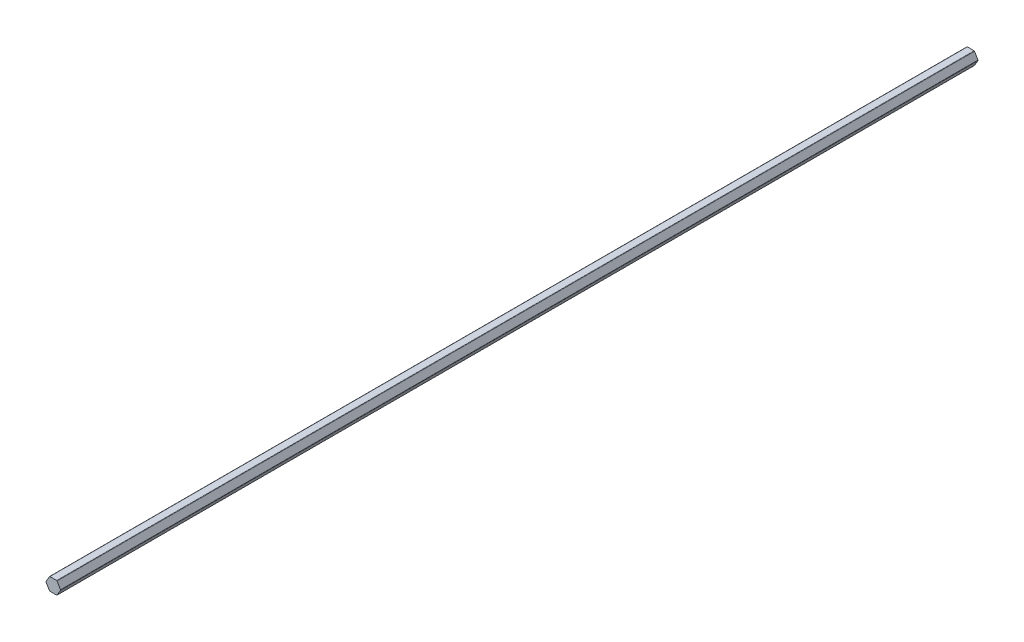
ISO-10303-21;
HEADER;
FILE_DESCRIPTION(('STEP AP214'),'2;1');
FILE_NAME('part.step','',(''),(''),'','','');
FILE_SCHEMA(('AUTOMOTIVE_DESIGN { 1 0 10303 214 1 1 1 1 }'));
ENDSEC;
DATA;
#1=APPLICATION_CONTEXT('core data for automotive mechanical design processes');
#2=APPLICATION_PROTOCOL_DEFINITION('international standard','automotive_design',2000,#1);
#3=PRODUCT_CONTEXT('',#1,'mechanical');
#4=PRODUCT('Part','Part','',(#3));
#5=PRODUCT_RELATED_PRODUCT_CATEGORY('part','',(#4));
#6=PRODUCT_DEFINITION_FORMATION('','',#4);
#7=PRODUCT_DEFINITION_CONTEXT('part definition',#1,'design');
#8=PRODUCT_DEFINITION('design','',#6,#7);
#9=PRODUCT_DEFINITION_SHAPE('','',#8);
#10=(LENGTH_UNIT() NAMED_UNIT(*) SI_UNIT(.MILLI.,.METRE.));
#11=(NAMED_UNIT(*) PLANE_ANGLE_UNIT() SI_UNIT($,.RADIAN.));
#12=(NAMED_UNIT(*) SI_UNIT($,.STERADIAN.) SOLID_ANGLE_UNIT());
#13=UNCERTAINTY_MEASURE_WITH_UNIT(LENGTH_MEASURE(1.E-05),#10,'distance_accuracy_value','');
#14=(GEOMETRIC_REPRESENTATION_CONTEXT(3) GLOBAL_UNCERTAINTY_ASSIGNED_CONTEXT((#13)) GLOBAL_UNIT_ASSIGNED_CONTEXT((#10,
#11,#12)) REPRESENTATION_CONTEXT('',''));
#15=CARTESIAN_POINT('',(0.,0.,0.));
#16=DIRECTION('',(0.,0.,1.));
#17=DIRECTION('',(1.,0.,0.));
#18=AXIS2_PLACEMENT_3D('',#15,#16,#17);
#19=CARTESIAN_POINT('',(-3.36554792418708,-5.8293,457.2));
#20=DIRECTION('',(0.,0.,-1.));
#21=DIRECTION('',(-1.,0.,0.));
#22=AXIS2_PLACEMENT_3D('',#19,#20,#21);
#23=CYLINDRICAL_SURFACE('',#22,0.508);
#24=CARTESIAN_POINT('',(-3.36554792418708,-5.8293,-457.2));
#25=DIRECTION('',(0.,0.,-1.));
#26=DIRECTION('',(-1.,0.,0.));
#27=AXIS2_PLACEMENT_3D('',#24,#25,#26);
#28=CIRCLE('',#27,0.508);
#29=CARTESIAN_POINT('',(-3.80548882930957,-6.0833,-457.2));
#30=VERTEX_POINT('',#29);
#31=CARTESIAN_POINT('',(-3.36554792418708,-6.3373,-457.2));
#32=VERTEX_POINT('',#31);
#33=EDGE_CURVE('E123',#30,#32,#28,.F.);
#34=ORIENTED_EDGE('',*,*,#33,.T.);
#35=DIRECTION('',(0.,0.,1.));
#36=VECTOR('',#35,1.);
#37=CARTESIAN_POINT('',(-3.36554792418708,-6.3373,457.2));
#38=LINE('',#37,#36);
#39=CARTESIAN_POINT('',(-3.36554792418708,-6.3373,457.2));
#40=VERTEX_POINT('',#39);
#41=EDGE_CURVE('E155',#32,#40,#38,.T.);
#42=ORIENTED_EDGE('',*,*,#41,.T.);
#43=CARTESIAN_POINT('',(-3.36554792418708,-5.8293,457.2));
#44=DIRECTION('',(0.,0.,-1.));
#45=DIRECTION('',(-1.,0.,0.));
#46=AXIS2_PLACEMENT_3D('',#43,#44,#45);
#47=CIRCLE('',#46,0.508);
#48=CARTESIAN_POINT('',(-3.80548882930957,-6.0833,457.2));
#49=VERTEX_POINT('',#48);
#50=EDGE_CURVE('E20',#40,#49,#47,.T.);
#51=ORIENTED_EDGE('',*,*,#50,.T.);
#52=DIRECTION('',(0.,0.,1.));
#53=VECTOR('',#52,1.);
#54=CARTESIAN_POINT('',(-3.80548882930957,-6.0833,457.2));
#55=LINE('',#54,#53);
#56=EDGE_CURVE('E119',#49,#30,#55,.F.);
#57=ORIENTED_EDGE('',*,*,#56,.T.);
#58=EDGE_LOOP('',(#34,#42,#51,#57));
#59=FACE_BOUND('',#58,.T.);
#60=ADVANCED_FACE('F17',(#59),#23,.T.);
#61=CARTESIAN_POINT('',(3.36554792418708,5.8293,457.2));
#62=DIRECTION('',(0.,0.,-1.));
#63=DIRECTION('',(-1.,0.,0.));
#64=AXIS2_PLACEMENT_3D('',#61,#62,#63);
#65=CYLINDRICAL_SURFACE('',#64,0.508);
#66=CARTESIAN_POINT('',(3.36554792418708,5.8293,-457.2));
#67=DIRECTION('',(0.,0.,-1.));
#68=DIRECTION('',(-1.,0.,0.));
#69=AXIS2_PLACEMENT_3D('',#66,#67,#68);
#70=CIRCLE('',#69,0.508);
#71=CARTESIAN_POINT('',(3.80548882930958,6.0833,-457.2));
#72=VERTEX_POINT('',#71);
#73=CARTESIAN_POINT('',(3.36554792418708,6.3373,-457.2));
#74=VERTEX_POINT('',#73);
#75=EDGE_CURVE('E177',#72,#74,#70,.F.);
#76=ORIENTED_EDGE('',*,*,#75,.T.);
#77=DIRECTION('',(0.,0.,1.));
#78=VECTOR('',#77,1.);
#79=CARTESIAN_POINT('',(3.36554792418708,6.3373,457.2));
#80=LINE('',#79,#78);
#81=CARTESIAN_POINT('',(3.36554792418708,6.3373,457.2));
#82=VERTEX_POINT('',#81);
#83=EDGE_CURVE('E147',#74,#82,#80,.T.);
#84=ORIENTED_EDGE('',*,*,#83,.T.);
#85=CARTESIAN_POINT('',(3.36554792418708,5.8293,457.2));
#86=DIRECTION('',(0.,0.,-1.));
#87=DIRECTION('',(-1.,0.,0.));
#88=AXIS2_PLACEMENT_3D('',#85,#86,#87);
#89=CIRCLE('',#88,0.508);
#90=CARTESIAN_POINT('',(3.80548882930958,6.0833,457.2));
#91=VERTEX_POINT('',#90);
#92=EDGE_CURVE('E179',#82,#91,#89,.T.);
#93=ORIENTED_EDGE('',*,*,#92,.T.);
#94=DIRECTION('',(0.,0.,1.));
#95=VECTOR('',#94,1.);
#96=CARTESIAN_POINT('',(3.80548882930958,6.0833,457.2));
#97=LINE('',#96,#95);
#98=EDGE_CURVE('E150',#91,#72,#97,.F.);
#99=ORIENTED_EDGE('',*,*,#98,.T.);
#100=EDGE_LOOP('',(#76,#84,#93,#99));
#101=FACE_BOUND('',#100,.T.);
#102=ADVANCED_FACE('F259',(#101),#65,.T.);
#103=CARTESIAN_POINT('',(-3.36554792418708,5.8293,457.2));
#104=DIRECTION('',(0.,0.,-1.));
#105=DIRECTION('',(-1.,0.,0.));
#106=AXIS2_PLACEMENT_3D('',#103,#104,#105);
#107=CYLINDRICAL_SURFACE('',#106,0.508);
#108=CARTESIAN_POINT('',(-3.36554792418708,5.8293,-457.2));
#109=DIRECTION('',(0.,0.,-1.));
#110=DIRECTION('',(-1.,0.,0.));
#111=AXIS2_PLACEMENT_3D('',#108,#109,#110);
#112=CIRCLE('',#111,0.508);
#113=CARTESIAN_POINT('',(-3.36554792418708,6.3373,-457.2));
#114=VERTEX_POINT('',#113);
#115=CARTESIAN_POINT('',(-3.80548882930958,6.0833,-457.2));
#116=VERTEX_POINT('',#115);
#117=EDGE_CURVE('E173',#114,#116,#112,.F.);
#118=ORIENTED_EDGE('',*,*,#117,.T.);
#119=DIRECTION('',(0.,0.,1.));
#120=VECTOR('',#119,1.);
#121=CARTESIAN_POINT('',(-3.80548882930958,6.0833,457.2));
#122=LINE('',#121,#120);
#123=CARTESIAN_POINT('',(-3.80548882930958,6.0833,457.2));
#124=VERTEX_POINT('',#123);
#125=EDGE_CURVE('E141',#116,#124,#122,.T.);
#126=ORIENTED_EDGE('',*,*,#125,.T.);
#127=CARTESIAN_POINT('',(-3.36554792418708,5.8293,457.2));
#128=DIRECTION('',(0.,0.,-1.));
#129=DIRECTION('',(-1.,0.,0.));
#130=AXIS2_PLACEMENT_3D('',#127,#128,#129);
#131=CIRCLE('',#130,0.508);
#132=CARTESIAN_POINT('',(-3.36554792418708,6.3373,457.2));
#133=VERTEX_POINT('',#132);
#134=EDGE_CURVE('E175',#124,#133,#131,.T.);
#135=ORIENTED_EDGE('',*,*,#134,.T.);
#136=DIRECTION('',(0.,0.,1.));
#137=VECTOR('',#136,1.);
#138=CARTESIAN_POINT('',(-3.36554792418708,6.3373,457.2));
#139=LINE('',#138,#137);
#140=EDGE_CURVE('E144',#133,#114,#139,.F.);
#141=ORIENTED_EDGE('',*,*,#140,.T.);
#142=EDGE_LOOP('',(#118,#126,#135,#141));
#143=FACE_BOUND('',#142,.T.);
#144=ADVANCED_FACE('F261',(#143),#107,.T.);
#145=CARTESIAN_POINT('',(-6.73109584837417,0.,457.2));
#146=DIRECTION('',(0.,0.,-1.));
#147=DIRECTION('',(-1.,0.,0.));
#148=AXIS2_PLACEMENT_3D('',#145,#146,#147);
#149=CYLINDRICAL_SURFACE('',#148,0.508);
#150=DIRECTION('',(0.,0.,1.));
#151=VECTOR('',#150,1.);
#152=CARTESIAN_POINT('',(-7.17103675349666,0.253999999999996,457.2));
#153=LINE('',#152,#151);
#154=CARTESIAN_POINT('',(-7.17103675349666,0.253999999999996,457.2));
#155=VERTEX_POINT('',#154);
#156=CARTESIAN_POINT('',(-7.17103675349666,0.253999999999996,-457.2));
#157=VERTEX_POINT('',#156);
#158=EDGE_CURVE('E105',#155,#157,#153,.F.);
#159=ORIENTED_EDGE('',*,*,#158,.T.);
#160=CARTESIAN_POINT('',(-6.73109584837417,0.,-457.2));
#161=DIRECTION('',(0.,0.,-1.));
#162=DIRECTION('',(-1.,0.,0.));
#163=AXIS2_PLACEMENT_3D('',#160,#161,#162);
#164=CIRCLE('',#163,0.508);
#165=CARTESIAN_POINT('',(-7.17103675349666,-0.254000000000004,-457.2));
#166=VERTEX_POINT('',#165);
#167=EDGE_CURVE('E99',#157,#166,#164,.F.);
#168=ORIENTED_EDGE('',*,*,#167,.T.);
#169=DIRECTION('',(0.,0.,1.));
#170=VECTOR('',#169,1.);
#171=CARTESIAN_POINT('',(-7.17103675349666,-0.254000000000004,457.2));
#172=LINE('',#171,#170);
#173=CARTESIAN_POINT('',(-7.17103675349666,-0.254000000000004,457.2));
#174=VERTEX_POINT('',#173);
#175=EDGE_CURVE('E102',#166,#174,#172,.T.);
#176=ORIENTED_EDGE('',*,*,#175,.T.);
#177=CARTESIAN_POINT('',(-6.73109584837417,0.,457.2));
#178=DIRECTION('',(0.,0.,-1.));
#179=DIRECTION('',(-1.,0.,0.));
#180=AXIS2_PLACEMENT_3D('',#177,#178,#179);
#181=CIRCLE('',#180,0.508);
#182=EDGE_CURVE('E110',#174,#155,#181,.T.);
#183=ORIENTED_EDGE('',*,*,#182,.T.);
#184=EDGE_LOOP('',(#159,#168,#176,#183));
#185=FACE_BOUND('',#184,.T.);
#186=ADVANCED_FACE('F101',(#185),#149,.T.);
#187=CARTESIAN_POINT('',(-7.31768372187083,0.,457.2));
#188=DIRECTION('',(0.866025403784438,0.5,0.));
#189=DIRECTION('',(-0.5,0.866025403784438,0.));
#190=AXIS2_PLACEMENT_3D('',#187,#188,#189);
#191=PLANE('',#190);
#192=ORIENTED_EDGE('',*,*,#56,.F.);
#193=DIRECTION('',(0.500000000000001,-0.866025403784438,0.));
#194=VECTOR('',#193,1.);
#195=CARTESIAN_POINT('',(-7.17103675349666,-0.254000000000004,457.2));
#196=LINE('',#195,#194);
#197=EDGE_CURVE('E118',#174,#49,#196,.T.);
#198=ORIENTED_EDGE('',*,*,#197,.F.);
#199=ORIENTED_EDGE('',*,*,#175,.F.);
#200=DIRECTION('',(0.500000000000001,-0.866025403784438,0.));
#201=VECTOR('',#200,1.);
#202=CARTESIAN_POINT('',(-7.17103675349666,-0.254000000000004,-457.2));
#203=LINE('',#202,#201);
#204=EDGE_CURVE('E116',#166,#30,#203,.T.);
#205=ORIENTED_EDGE('',*,*,#204,.T.);
#206=EDGE_LOOP('',(#192,#198,#199,#205));
#207=FACE_BOUND('',#206,.T.);
#208=ADVANCED_FACE('F115',(#207),#191,.F.);
#209=CARTESIAN_POINT('',(-3.65884186093541,-6.3373,457.2));
#210=DIRECTION('',(0.,1.,0.));
#211=DIRECTION('',(-1.,0.,0.));
#212=AXIS2_PLACEMENT_3D('',#209,#210,#211);
#213=PLANE('',#212);
#214=ORIENTED_EDGE('',*,*,#41,.F.);
#215=DIRECTION('',(1.,0.,0.));
#216=VECTOR('',#215,1.);
#217=CARTESIAN_POINT('',(7.31768372187083,-6.3373,-457.2));
#218=LINE('',#217,#216);
#219=CARTESIAN_POINT('',(3.36554792418708,-6.3373,-457.2));
#220=VERTEX_POINT('',#219);
#221=EDGE_CURVE('E125',#32,#220,#218,.T.);
#222=ORIENTED_EDGE('',*,*,#221,.T.);
#223=DIRECTION('',(0.,0.,-1.));
#224=VECTOR('',#223,1.);
#225=CARTESIAN_POINT('',(3.36554792418708,-6.3373,457.2));
#226=LINE('',#225,#224);
#227=CARTESIAN_POINT('',(3.36554792418708,-6.3373,457.2));
#228=VERTEX_POINT('',#227);
#229=EDGE_CURVE('E129',#228,#220,#226,.T.);
#230=ORIENTED_EDGE('',*,*,#229,.F.);
#231=DIRECTION('',(1.,0.,0.));
#232=VECTOR('',#231,1.);
#233=CARTESIAN_POINT('',(7.31768372187083,-6.3373,457.2));
#234=LINE('',#233,#232);
#235=EDGE_CURVE('E168',#40,#228,#234,.T.);
#236=ORIENTED_EDGE('',*,*,#235,.F.);
#237=EDGE_LOOP('',(#214,#222,#230,#236));
#238=FACE_BOUND('',#237,.T.);
#239=ADVANCED_FACE('F214',(#238),#213,.F.);
#240=CARTESIAN_POINT('',(7.31768372187083,0.,457.2));
#241=DIRECTION('',(-0.866025403784439,-0.5,0.));
#242=DIRECTION('',(0.5,-0.866025403784439,0.));
#243=AXIS2_PLACEMENT_3D('',#240,#241,#242);
#244=PLANE('',#243);
#245=DIRECTION('',(0.,0.,-1.));
#246=VECTOR('',#245,1.);
#247=CARTESIAN_POINT('',(7.17103675349666,0.254000000000004,457.2));
#248=LINE('',#247,#246);
#249=CARTESIAN_POINT('',(7.17103675349666,0.254000000000003,-457.2));
#250=VERTEX_POINT('',#249);
#251=CARTESIAN_POINT('',(7.17103675349666,0.254000000000003,457.2));
#252=VERTEX_POINT('',#251);
#253=EDGE_CURVE('E146',#250,#252,#248,.F.);
#254=ORIENTED_EDGE('',*,*,#253,.F.);
#255=DIRECTION('',(-0.5,0.866025403784438,0.));
#256=VECTOR('',#255,1.);
#257=CARTESIAN_POINT('',(7.17103675349666,0.254000000000003,-457.2));
#258=LINE('',#257,#256);
#259=EDGE_CURVE('E137',#250,#72,#258,.T.);
#260=ORIENTED_EDGE('',*,*,#259,.T.);
#261=ORIENTED_EDGE('',*,*,#98,.F.);
#262=DIRECTION('',(-0.5,0.866025403784438,0.));
#263=VECTOR('',#262,1.);
#264=CARTESIAN_POINT('',(7.17103675349666,0.254000000000003,457.2));
#265=LINE('',#264,#263);
#266=EDGE_CURVE('E166',#252,#91,#265,.T.);
#267=ORIENTED_EDGE('',*,*,#266,.F.);
#268=EDGE_LOOP('',(#254,#260,#261,#267));
#269=FACE_BOUND('',#268,.T.);
#270=ADVANCED_FACE('F216',(#269),#244,.F.);
#271=CARTESIAN_POINT('',(3.65884186093541,6.3373,457.2));
#272=DIRECTION('',(0.,-1.,0.));
#273=DIRECTION('',(1.,0.,0.));
#274=AXIS2_PLACEMENT_3D('',#271,#272,#273);
#275=PLANE('',#274);
#276=ORIENTED_EDGE('',*,*,#140,.F.);
#277=DIRECTION('',(1.,0.,0.));
#278=VECTOR('',#277,1.);
#279=CARTESIAN_POINT('',(7.31768372187083,6.3373,457.2));
#280=LINE('',#279,#278);
#281=EDGE_CURVE('E252',#82,#133,#280,.F.);
#282=ORIENTED_EDGE('',*,*,#281,.F.);
#283=ORIENTED_EDGE('',*,*,#83,.F.);
#284=DIRECTION('',(1.,0.,0.));
#285=VECTOR('',#284,1.);
#286=CARTESIAN_POINT('',(7.31768372187083,6.3373,-457.2));
#287=LINE('',#286,#285);
#288=EDGE_CURVE('E131',#74,#114,#287,.F.);
#289=ORIENTED_EDGE('',*,*,#288,.T.);
#290=EDGE_LOOP('',(#276,#282,#283,#289));
#291=FACE_BOUND('',#290,.T.);
#292=ADVANCED_FACE('F223',(#291),#275,.F.);
#293=CARTESIAN_POINT('',(-3.65884186093541,6.3373,457.2));
#294=DIRECTION('',(0.866025403784439,-0.5,0.));
#295=DIRECTION('',(0.5,0.866025403784439,0.));
#296=AXIS2_PLACEMENT_3D('',#293,#294,#295);
#297=PLANE('',#296);
#298=ORIENTED_EDGE('',*,*,#158,.F.);
#299=DIRECTION('',(-0.5,-0.866025403784439,0.));
#300=VECTOR('',#299,1.);
#301=CARTESIAN_POINT('',(-3.80548882930958,6.0833,457.2));
#302=LINE('',#301,#300);
#303=EDGE_CURVE('E195',#124,#155,#302,.T.);
#304=ORIENTED_EDGE('',*,*,#303,.F.);
#305=ORIENTED_EDGE('',*,*,#125,.F.);
#306=DIRECTION('',(-0.5,-0.866025403784439,0.));
#307=VECTOR('',#306,1.);
#308=CARTESIAN_POINT('',(-3.80548882930958,6.0833,-457.2));
#309=LINE('',#308,#307);
#310=EDGE_CURVE('E126',#116,#157,#309,.T.);
#311=ORIENTED_EDGE('',*,*,#310,.T.);
#312=EDGE_LOOP('',(#298,#304,#305,#311));
#313=FACE_BOUND('',#312,.T.);
#314=ADVANCED_FACE('F240',(#313),#297,.F.);
#315=CARTESIAN_POINT('',(6.73109584837417,0.,457.2));
#316=DIRECTION('',(0.,0.,-1.));
#317=DIRECTION('',(-1.,0.,0.));
#318=AXIS2_PLACEMENT_3D('',#315,#316,#317);
#319=CYLINDRICAL_SURFACE('',#318,0.508);
#320=CARTESIAN_POINT('',(6.73109584837417,0.,-457.2));
#321=DIRECTION('',(0.,0.,-1.));
#322=DIRECTION('',(-1.,0.,0.));
#323=AXIS2_PLACEMENT_3D('',#320,#321,#322);
#324=CIRCLE('',#323,0.508);
#325=CARTESIAN_POINT('',(7.17103675349666,-0.253999999999997,-457.2));
#326=VERTEX_POINT('',#325);
#327=EDGE_CURVE('E140',#326,#250,#324,.F.);
#328=ORIENTED_EDGE('',*,*,#327,.T.);
#329=ORIENTED_EDGE('',*,*,#253,.T.);
#330=CARTESIAN_POINT('',(6.73109584837417,0.,457.2));
#331=DIRECTION('',(0.,0.,-1.));
#332=DIRECTION('',(-1.,0.,0.));
#333=AXIS2_PLACEMENT_3D('',#330,#331,#332);
#334=CIRCLE('',#333,0.508);
#335=CARTESIAN_POINT('',(7.17103675349667,-0.253999999999996,457.2));
#336=VERTEX_POINT('',#335);
#337=EDGE_CURVE('E163',#336,#252,#334,.F.);
#338=ORIENTED_EDGE('',*,*,#337,.F.);
#339=DIRECTION('',(0.,0.,1.));
#340=VECTOR('',#339,1.);
#341=CARTESIAN_POINT('',(7.17103675349666,-0.253999999999996,457.2));
#342=LINE('',#341,#340);
#343=EDGE_CURVE('E193',#336,#326,#342,.F.);
#344=ORIENTED_EDGE('',*,*,#343,.T.);
#345=EDGE_LOOP('',(#328,#329,#338,#344));
#346=FACE_BOUND('',#345,.T.);
#347=ADVANCED_FACE('F206',(#346),#319,.T.);
#348=CARTESIAN_POINT('',(7.31768372187083,0.,-457.2));
#349=DIRECTION('',(0.,0.,1.));
#350=DIRECTION('',(1.,0.,0.));
#351=AXIS2_PLACEMENT_3D('',#348,#349,#350);
#352=PLANE('',#351);
#353=ORIENTED_EDGE('',*,*,#33,.F.);
#354=ORIENTED_EDGE('',*,*,#204,.F.);
#355=ORIENTED_EDGE('',*,*,#167,.F.);
#356=ORIENTED_EDGE('',*,*,#310,.F.);
#357=ORIENTED_EDGE('',*,*,#117,.F.);
#358=ORIENTED_EDGE('',*,*,#288,.F.);
#359=ORIENTED_EDGE('',*,*,#75,.F.);
#360=ORIENTED_EDGE('',*,*,#259,.F.);
#361=ORIENTED_EDGE('',*,*,#327,.F.);
#362=DIRECTION('',(-0.5,-0.866025403784439,0.));
#363=VECTOR('',#362,1.);
#364=CARTESIAN_POINT('',(3.65884186093542,-6.3373,-457.2));
#365=LINE('',#364,#363);
#366=CARTESIAN_POINT('',(3.80548882930958,-6.0833,-457.2));
#367=VERTEX_POINT('',#366);
#368=EDGE_CURVE('E191',#326,#367,#365,.T.);
#369=ORIENTED_EDGE('',*,*,#368,.T.);
#370=CARTESIAN_POINT('',(3.36554792418709,-5.8293,-457.2));
#371=DIRECTION('',(0.,0.,-1.));
#372=DIRECTION('',(-1.,0.,0.));
#373=AXIS2_PLACEMENT_3D('',#370,#371,#372);
#374=CIRCLE('',#373,0.508);
#375=EDGE_CURVE('E159',#220,#367,#374,.F.);
#376=ORIENTED_EDGE('',*,*,#375,.F.);
#377=ORIENTED_EDGE('',*,*,#221,.F.);
#378=EDGE_LOOP('',(#353,#354,#355,#356,#357,#358,#359,#360,#361,#369,#376,#377));
#379=FACE_BOUND('',#378,.T.);
#380=ADVANCED_FACE('F121',(#379),#352,.F.);
#381=CARTESIAN_POINT('',(3.36554792418709,-5.8293,457.2));
#382=DIRECTION('',(0.,0.,-1.));
#383=DIRECTION('',(-1.,0.,0.));
#384=AXIS2_PLACEMENT_3D('',#381,#382,#383);
#385=CYLINDRICAL_SURFACE('',#384,0.508);
#386=ORIENTED_EDGE('',*,*,#375,.T.);
#387=DIRECTION('',(0.,0.,1.));
#388=VECTOR('',#387,1.);
#389=CARTESIAN_POINT('',(3.80548882930958,-6.0833,457.2));
#390=LINE('',#389,#388);
#391=CARTESIAN_POINT('',(3.80548882930958,-6.0833,457.2));
#392=VERTEX_POINT('',#391);
#393=EDGE_CURVE('E26',#367,#392,#390,.T.);
#394=ORIENTED_EDGE('',*,*,#393,.T.);
#395=CARTESIAN_POINT('',(3.36554792418709,-5.8293,457.2));
#396=DIRECTION('',(0.,0.,-1.));
#397=DIRECTION('',(-1.,0.,0.));
#398=AXIS2_PLACEMENT_3D('',#395,#396,#397);
#399=CIRCLE('',#398,0.508);
#400=EDGE_CURVE('E34',#228,#392,#399,.F.);
#401=ORIENTED_EDGE('',*,*,#400,.F.);
#402=ORIENTED_EDGE('',*,*,#229,.T.);
#403=EDGE_LOOP('',(#386,#394,#401,#402));
#404=FACE_BOUND('',#403,.T.);
#405=ADVANCED_FACE('F211',(#404),#385,.T.);
#406=CARTESIAN_POINT('',(7.31768372187083,0.,457.2));
#407=DIRECTION('',(0.,0.,1.));
#408=DIRECTION('',(1.,0.,0.));
#409=AXIS2_PLACEMENT_3D('',#406,#407,#408);
#410=PLANE('',#409);
#411=ORIENTED_EDGE('',*,*,#182,.F.);
#412=ORIENTED_EDGE('',*,*,#197,.T.);
#413=ORIENTED_EDGE('',*,*,#50,.F.);
#414=ORIENTED_EDGE('',*,*,#235,.T.);
#415=ORIENTED_EDGE('',*,*,#400,.T.);
#416=DIRECTION('',(-0.5,-0.866025403784439,0.));
#417=VECTOR('',#416,1.);
#418=CARTESIAN_POINT('',(3.65884186093542,-6.3373,457.2));
#419=LINE('',#418,#417);
#420=EDGE_CURVE('E10',#392,#336,#419,.F.);
#421=ORIENTED_EDGE('',*,*,#420,.T.);
#422=ORIENTED_EDGE('',*,*,#337,.T.);
#423=ORIENTED_EDGE('',*,*,#266,.T.);
#424=ORIENTED_EDGE('',*,*,#92,.F.);
#425=ORIENTED_EDGE('',*,*,#281,.T.);
#426=ORIENTED_EDGE('',*,*,#134,.F.);
#427=ORIENTED_EDGE('',*,*,#303,.T.);
#428=EDGE_LOOP('',(#411,#412,#413,#414,#415,#421,#422,#423,#424,#425,#426,#427));
#429=FACE_BOUND('',#428,.T.);
#430=ADVANCED_FACE('F184',(#429),#410,.T.);
#431=CARTESIAN_POINT('',(3.65884186093542,-6.3373,457.2));
#432=DIRECTION('',(-0.866025403784439,0.5,0.));
#433=DIRECTION('',(-0.5,-0.866025403784439,0.));
#434=AXIS2_PLACEMENT_3D('',#431,#432,#433);
#435=PLANE('',#434);
#436=ORIENTED_EDGE('',*,*,#393,.F.);
#437=ORIENTED_EDGE('',*,*,#368,.F.);
#438=ORIENTED_EDGE('',*,*,#343,.F.);
#439=ORIENTED_EDGE('',*,*,#420,.F.);
#440=EDGE_LOOP('',(#436,#437,#438,#439));
#441=FACE_BOUND('',#440,.T.);
#442=ADVANCED_FACE('F203',(#441),#435,.F.);
#443=CLOSED_SHELL('',(#60,#102,#144,#186,#208,#239,#270,#292,#314,#347,#380,#405,#430,#442));
#444=MANIFOLD_SOLID_BREP('B1',#443);
#445=ADVANCED_BREP_SHAPE_REPRESENTATION('',(#18,#444),#14);
#446=SHAPE_DEFINITION_REPRESENTATION(#9,#445);
ENDSEC;
END-ISO-10303-21;
